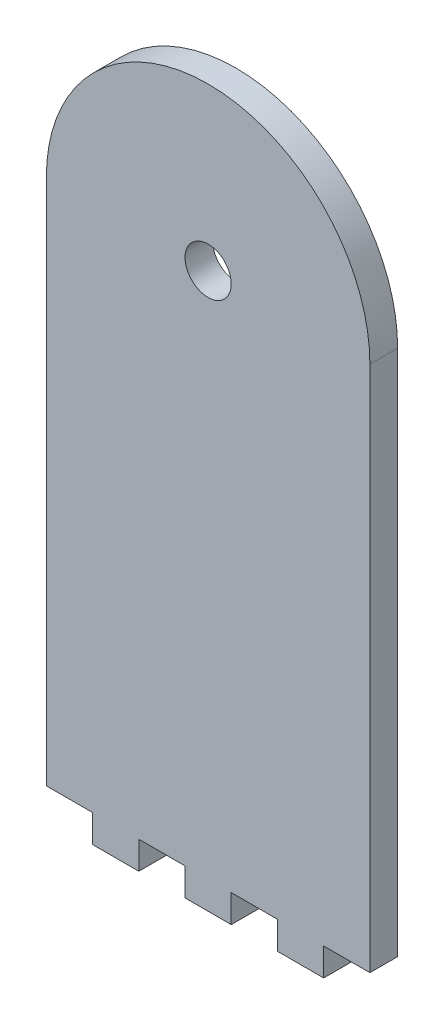
ISO-10303-21;
HEADER;
FILE_DESCRIPTION(('STEP AP214'),'2;1');
FILE_NAME('part.step','',(''),(''),'','','');
FILE_SCHEMA(('AUTOMOTIVE_DESIGN { 1 0 10303 214 1 1 1 1 }'));
ENDSEC;
DATA;
#1=APPLICATION_CONTEXT('core data for automotive mechanical design processes');
#2=APPLICATION_PROTOCOL_DEFINITION('international standard','automotive_design',2000,#1);
#3=PRODUCT_CONTEXT('',#1,'mechanical');
#4=PRODUCT('Part','Part','',(#3));
#5=PRODUCT_RELATED_PRODUCT_CATEGORY('part','',(#4));
#6=PRODUCT_DEFINITION_FORMATION('','',#4);
#7=PRODUCT_DEFINITION_CONTEXT('part definition',#1,'design');
#8=PRODUCT_DEFINITION('design','',#6,#7);
#9=PRODUCT_DEFINITION_SHAPE('','',#8);
#10=(LENGTH_UNIT() NAMED_UNIT(*) SI_UNIT(.MILLI.,.METRE.));
#11=(NAMED_UNIT(*) PLANE_ANGLE_UNIT() SI_UNIT($,.RADIAN.));
#12=(NAMED_UNIT(*) SI_UNIT($,.STERADIAN.) SOLID_ANGLE_UNIT());
#13=UNCERTAINTY_MEASURE_WITH_UNIT(LENGTH_MEASURE(1.E-05),#10,'distance_accuracy_value','');
#14=(GEOMETRIC_REPRESENTATION_CONTEXT(3) GLOBAL_UNCERTAINTY_ASSIGNED_CONTEXT((#13)) GLOBAL_UNIT_ASSIGNED_CONTEXT((#10,
#11,#12)) REPRESENTATION_CONTEXT('',''));
#15=CARTESIAN_POINT('',(0.,0.,0.));
#16=DIRECTION('',(0.,0.,1.));
#17=DIRECTION('',(1.,0.,0.));
#18=AXIS2_PLACEMENT_3D('',#15,#16,#17);
#19=CARTESIAN_POINT('',(0.,30.,3.));
#20=DIRECTION('',(0.,0.,-1.));
#21=DIRECTION('',(-1.,0.,0.));
#22=AXIS2_PLACEMENT_3D('',#19,#20,#21);
#23=PLANE('',#22);
#24=CARTESIAN_POINT('',(0.,30.,3.));
#25=DIRECTION('',(0.,0.,1.));
#26=DIRECTION('',(-1.,0.,0.));
#27=AXIS2_PLACEMENT_3D('',#24,#25,#26);
#28=CIRCLE('',#27,17.5);
#29=CARTESIAN_POINT('',(17.5,30.,3.));
#30=VERTEX_POINT('',#29);
#31=CARTESIAN_POINT('',(-17.5,30.,3.));
#32=VERTEX_POINT('',#31);
#33=EDGE_CURVE('E209',#30,#32,#28,.T.);
#34=ORIENTED_EDGE('',*,*,#33,.T.);
#35=DIRECTION('',(0.,-1.,0.));
#36=VECTOR('',#35,1.);
#37=CARTESIAN_POINT('',(-17.5,-27.,3.));
#38=LINE('',#37,#36);
#39=CARTESIAN_POINT('',(-17.5,-27.,3.));
#40=VERTEX_POINT('',#39);
#41=EDGE_CURVE('E117',#32,#40,#38,.T.);
#42=ORIENTED_EDGE('',*,*,#41,.T.);
#43=DIRECTION('',(1.,0.,0.));
#44=VECTOR('',#43,1.);
#45=CARTESIAN_POINT('',(-17.5,-27.,3.));
#46=LINE('',#45,#44);
#47=CARTESIAN_POINT('',(-12.5,-27.,3.));
#48=VERTEX_POINT('',#47);
#49=EDGE_CURVE('E248',#40,#48,#46,.T.);
#50=ORIENTED_EDGE('',*,*,#49,.T.);
#51=DIRECTION('',(0.,-1.,0.));
#52=VECTOR('',#51,1.);
#53=CARTESIAN_POINT('',(-12.5,-30.,3.));
#54=LINE('',#53,#52);
#55=CARTESIAN_POINT('',(-12.5,-30.,3.));
#56=VERTEX_POINT('',#55);
#57=EDGE_CURVE('E267',#48,#56,#54,.T.);
#58=ORIENTED_EDGE('',*,*,#57,.T.);
#59=DIRECTION('',(1.,0.,0.));
#60=VECTOR('',#59,1.);
#61=CARTESIAN_POINT('',(-12.5,-30.,3.));
#62=LINE('',#61,#60);
#63=CARTESIAN_POINT('',(-7.49999999999999,-30.,3.));
#64=VERTEX_POINT('',#63);
#65=EDGE_CURVE('E264',#56,#64,#62,.T.);
#66=ORIENTED_EDGE('',*,*,#65,.T.);
#67=DIRECTION('',(0.,1.,0.));
#68=VECTOR('',#67,1.);
#69=CARTESIAN_POINT('',(-7.49999999999999,-30.,3.));
#70=LINE('',#69,#68);
#71=CARTESIAN_POINT('',(-7.49999999999999,-27.,3.));
#72=VERTEX_POINT('',#71);
#73=EDGE_CURVE('E266',#64,#72,#70,.T.);
#74=ORIENTED_EDGE('',*,*,#73,.T.);
#75=DIRECTION('',(1.,0.,0.));
#76=VECTOR('',#75,1.);
#77=CARTESIAN_POINT('',(-7.49999999999999,-27.,3.));
#78=LINE('',#77,#76);
#79=CARTESIAN_POINT('',(-2.49999999999999,-27.,3.));
#80=VERTEX_POINT('',#79);
#81=EDGE_CURVE('E269',#72,#80,#78,.T.);
#82=ORIENTED_EDGE('',*,*,#81,.T.);
#83=DIRECTION('',(0.,-1.,0.));
#84=VECTOR('',#83,1.);
#85=CARTESIAN_POINT('',(-2.49999999999999,-27.,3.));
#86=LINE('',#85,#84);
#87=CARTESIAN_POINT('',(-2.49999999999999,-30.,3.));
#88=VERTEX_POINT('',#87);
#89=EDGE_CURVE('E275',#80,#88,#86,.T.);
#90=ORIENTED_EDGE('',*,*,#89,.T.);
#91=DIRECTION('',(1.,0.,0.));
#92=VECTOR('',#91,1.);
#93=CARTESIAN_POINT('',(-2.49999999999999,-30.,3.));
#94=LINE('',#93,#92);
#95=CARTESIAN_POINT('',(2.50000000000001,-30.,3.));
#96=VERTEX_POINT('',#95);
#97=EDGE_CURVE('E277',#88,#96,#94,.T.);
#98=ORIENTED_EDGE('',*,*,#97,.T.);
#99=DIRECTION('',(0.,1.,0.));
#100=VECTOR('',#99,1.);
#101=CARTESIAN_POINT('',(2.50000000000001,-30.,3.));
#102=LINE('',#101,#100);
#103=CARTESIAN_POINT('',(2.50000000000001,-27.,3.));
#104=VERTEX_POINT('',#103);
#105=EDGE_CURVE('E279',#96,#104,#102,.T.);
#106=ORIENTED_EDGE('',*,*,#105,.T.);
#107=DIRECTION('',(1.,0.,0.));
#108=VECTOR('',#107,1.);
#109=CARTESIAN_POINT('',(2.50000000000001,-27.,3.));
#110=LINE('',#109,#108);
#111=CARTESIAN_POINT('',(7.50000000000001,-27.,3.));
#112=VERTEX_POINT('',#111);
#113=EDGE_CURVE('E281',#104,#112,#110,.T.);
#114=ORIENTED_EDGE('',*,*,#113,.T.);
#115=DIRECTION('',(0.,-1.,0.));
#116=VECTOR('',#115,1.);
#117=CARTESIAN_POINT('',(7.50000000000001,-27.,3.));
#118=LINE('',#117,#116);
#119=CARTESIAN_POINT('',(7.50000000000001,-30.,3.));
#120=VERTEX_POINT('',#119);
#121=EDGE_CURVE('E283',#112,#120,#118,.T.);
#122=ORIENTED_EDGE('',*,*,#121,.T.);
#123=DIRECTION('',(1.,0.,0.));
#124=VECTOR('',#123,1.);
#125=CARTESIAN_POINT('',(7.50000000000001,-30.,3.));
#126=LINE('',#125,#124);
#127=CARTESIAN_POINT('',(12.5,-30.,3.));
#128=VERTEX_POINT('',#127);
#129=EDGE_CURVE('E160',#120,#128,#126,.T.);
#130=ORIENTED_EDGE('',*,*,#129,.T.);
#131=DIRECTION('',(0.,1.,0.));
#132=VECTOR('',#131,1.);
#133=CARTESIAN_POINT('',(12.5,-30.,3.));
#134=LINE('',#133,#132);
#135=CARTESIAN_POINT('',(12.5,-27.,3.));
#136=VERTEX_POINT('',#135);
#137=EDGE_CURVE('E154',#128,#136,#134,.T.);
#138=ORIENTED_EDGE('',*,*,#137,.T.);
#139=DIRECTION('',(1.,0.,0.));
#140=VECTOR('',#139,1.);
#141=CARTESIAN_POINT('',(12.5,-27.,3.));
#142=LINE('',#141,#140);
#143=CARTESIAN_POINT('',(17.5,-27.,3.));
#144=VERTEX_POINT('',#143);
#145=EDGE_CURVE('E158',#136,#144,#142,.T.);
#146=ORIENTED_EDGE('',*,*,#145,.T.);
#147=DIRECTION('',(0.,1.,0.));
#148=VECTOR('',#147,1.);
#149=CARTESIAN_POINT('',(17.5,-27.,3.));
#150=LINE('',#149,#148);
#151=EDGE_CURVE('E50',#144,#30,#150,.T.);
#152=ORIENTED_EDGE('',*,*,#151,.T.);
#153=EDGE_LOOP('',(#34,#42,#50,#58,#66,#74,#82,#90,#98,#106,#114,#122,#130,#138,#146,#152));
#154=FACE_BOUND('',#153,.T.);
#155=CARTESIAN_POINT('',(0.,30.,3.));
#156=DIRECTION('',(0.,0.,1.));
#157=DIRECTION('',(1.,0.,0.));
#158=AXIS2_PLACEMENT_3D('',#155,#156,#157);
#159=CIRCLE('',#158,2.5);
#160=CARTESIAN_POINT('',(2.5,30.,3.));
#161=VERTEX_POINT('',#160);
#162=EDGE_CURVE('E182',#161,#161,#159,.T.);
#163=ORIENTED_EDGE('',*,*,#162,.F.);
#164=EDGE_LOOP('',(#163));
#165=FACE_BOUND('',#164,.T.);
#166=ADVANCED_FACE('F33',(#154,#165),#23,.F.);
#167=CARTESIAN_POINT('',(0.,30.,0.));
#168=DIRECTION('',(0.,0.,-1.));
#169=DIRECTION('',(-1.,0.,0.));
#170=AXIS2_PLACEMENT_3D('',#167,#168,#169);
#171=PLANE('',#170);
#172=CARTESIAN_POINT('',(0.,30.,0.));
#173=DIRECTION('',(0.,0.,1.));
#174=DIRECTION('',(-1.,0.,0.));
#175=AXIS2_PLACEMENT_3D('',#172,#173,#174);
#176=CIRCLE('',#175,17.5);
#177=CARTESIAN_POINT('',(17.5,30.,0.));
#178=VERTEX_POINT('',#177);
#179=CARTESIAN_POINT('',(-17.5,30.,0.));
#180=VERTEX_POINT('',#179);
#181=EDGE_CURVE('E178',#178,#180,#176,.T.);
#182=ORIENTED_EDGE('',*,*,#181,.F.);
#183=DIRECTION('',(0.,1.,0.));
#184=VECTOR('',#183,1.);
#185=CARTESIAN_POINT('',(17.5,-27.,0.));
#186=LINE('',#185,#184);
#187=CARTESIAN_POINT('',(17.5,-27.,0.));
#188=VERTEX_POINT('',#187);
#189=EDGE_CURVE('E109',#188,#178,#186,.T.);
#190=ORIENTED_EDGE('',*,*,#189,.F.);
#191=DIRECTION('',(1.,0.,0.));
#192=VECTOR('',#191,1.);
#193=CARTESIAN_POINT('',(12.5,-27.,0.));
#194=LINE('',#193,#192);
#195=CARTESIAN_POINT('',(12.5,-27.,0.));
#196=VERTEX_POINT('',#195);
#197=EDGE_CURVE('E103',#196,#188,#194,.T.);
#198=ORIENTED_EDGE('',*,*,#197,.F.);
#199=DIRECTION('',(0.,1.,0.));
#200=VECTOR('',#199,1.);
#201=CARTESIAN_POINT('',(12.5,-30.,0.));
#202=LINE('',#201,#200);
#203=CARTESIAN_POINT('',(12.5,-30.,0.));
#204=VERTEX_POINT('',#203);
#205=EDGE_CURVE('E168',#204,#196,#202,.T.);
#206=ORIENTED_EDGE('',*,*,#205,.F.);
#207=DIRECTION('',(1.,0.,0.));
#208=VECTOR('',#207,1.);
#209=CARTESIAN_POINT('',(7.50000000000001,-30.,0.));
#210=LINE('',#209,#208);
#211=CARTESIAN_POINT('',(7.50000000000001,-30.,0.));
#212=VERTEX_POINT('',#211);
#213=EDGE_CURVE('E204',#212,#204,#210,.T.);
#214=ORIENTED_EDGE('',*,*,#213,.F.);
#215=DIRECTION('',(0.,-1.,0.));
#216=VECTOR('',#215,1.);
#217=CARTESIAN_POINT('',(7.50000000000001,-27.,0.));
#218=LINE('',#217,#216);
#219=CARTESIAN_POINT('',(7.50000000000001,-27.,0.));
#220=VERTEX_POINT('',#219);
#221=EDGE_CURVE('E202',#220,#212,#218,.T.);
#222=ORIENTED_EDGE('',*,*,#221,.F.);
#223=DIRECTION('',(1.,0.,0.));
#224=VECTOR('',#223,1.);
#225=CARTESIAN_POINT('',(2.50000000000001,-27.,0.));
#226=LINE('',#225,#224);
#227=CARTESIAN_POINT('',(2.50000000000001,-27.,0.));
#228=VERTEX_POINT('',#227);
#229=EDGE_CURVE('E200',#228,#220,#226,.T.);
#230=ORIENTED_EDGE('',*,*,#229,.F.);
#231=DIRECTION('',(0.,1.,0.));
#232=VECTOR('',#231,1.);
#233=CARTESIAN_POINT('',(2.50000000000001,-30.,0.));
#234=LINE('',#233,#232);
#235=CARTESIAN_POINT('',(2.50000000000001,-30.,0.));
#236=VERTEX_POINT('',#235);
#237=EDGE_CURVE('E198',#236,#228,#234,.T.);
#238=ORIENTED_EDGE('',*,*,#237,.F.);
#239=DIRECTION('',(1.,0.,0.));
#240=VECTOR('',#239,1.);
#241=CARTESIAN_POINT('',(-2.49999999999999,-30.,0.));
#242=LINE('',#241,#240);
#243=CARTESIAN_POINT('',(-2.49999999999999,-30.,0.));
#244=VERTEX_POINT('',#243);
#245=EDGE_CURVE('E196',#244,#236,#242,.T.);
#246=ORIENTED_EDGE('',*,*,#245,.F.);
#247=DIRECTION('',(0.,-1.,0.));
#248=VECTOR('',#247,1.);
#249=CARTESIAN_POINT('',(-2.49999999999999,-27.,0.));
#250=LINE('',#249,#248);
#251=CARTESIAN_POINT('',(-2.49999999999999,-27.,0.));
#252=VERTEX_POINT('',#251);
#253=EDGE_CURVE('E194',#252,#244,#250,.T.);
#254=ORIENTED_EDGE('',*,*,#253,.F.);
#255=DIRECTION('',(1.,0.,0.));
#256=VECTOR('',#255,1.);
#257=CARTESIAN_POINT('',(-7.49999999999999,-27.,0.));
#258=LINE('',#257,#256);
#259=CARTESIAN_POINT('',(-7.49999999999999,-27.,0.));
#260=VERTEX_POINT('',#259);
#261=EDGE_CURVE('E192',#260,#252,#258,.T.);
#262=ORIENTED_EDGE('',*,*,#261,.F.);
#263=DIRECTION('',(0.,1.,0.));
#264=VECTOR('',#263,1.);
#265=CARTESIAN_POINT('',(-7.49999999999999,-30.,0.));
#266=LINE('',#265,#264);
#267=CARTESIAN_POINT('',(-7.49999999999999,-30.,0.));
#268=VERTEX_POINT('',#267);
#269=EDGE_CURVE('E190',#268,#260,#266,.T.);
#270=ORIENTED_EDGE('',*,*,#269,.F.);
#271=DIRECTION('',(1.,0.,0.));
#272=VECTOR('',#271,1.);
#273=CARTESIAN_POINT('',(-12.5,-30.,0.));
#274=LINE('',#273,#272);
#275=CARTESIAN_POINT('',(-12.5,-30.,0.));
#276=VERTEX_POINT('',#275);
#277=EDGE_CURVE('E188',#276,#268,#274,.T.);
#278=ORIENTED_EDGE('',*,*,#277,.F.);
#279=DIRECTION('',(0.,-1.,0.));
#280=VECTOR('',#279,1.);
#281=CARTESIAN_POINT('',(-12.5,-30.,0.));
#282=LINE('',#281,#280);
#283=CARTESIAN_POINT('',(-12.5,-27.,0.));
#284=VERTEX_POINT('',#283);
#285=EDGE_CURVE('E186',#284,#276,#282,.T.);
#286=ORIENTED_EDGE('',*,*,#285,.F.);
#287=DIRECTION('',(1.,0.,0.));
#288=VECTOR('',#287,1.);
#289=CARTESIAN_POINT('',(-17.5,-27.,0.));
#290=LINE('',#289,#288);
#291=CARTESIAN_POINT('',(-17.5,-27.,0.));
#292=VERTEX_POINT('',#291);
#293=EDGE_CURVE('E184',#292,#284,#290,.T.);
#294=ORIENTED_EDGE('',*,*,#293,.F.);
#295=DIRECTION('',(0.,-1.,0.));
#296=VECTOR('',#295,1.);
#297=CARTESIAN_POINT('',(-17.5,-27.,0.));
#298=LINE('',#297,#296);
#299=EDGE_CURVE('E181',#180,#292,#298,.T.);
#300=ORIENTED_EDGE('',*,*,#299,.F.);
#301=EDGE_LOOP('',(#182,#190,#198,#206,#214,#222,#230,#238,#246,#254,#262,#270,#278,#286,#294,#300));
#302=FACE_BOUND('',#301,.T.);
#303=CARTESIAN_POINT('',(0.,30.,0.));
#304=DIRECTION('',(0.,0.,1.));
#305=DIRECTION('',(1.,0.,0.));
#306=AXIS2_PLACEMENT_3D('',#303,#304,#305);
#307=CIRCLE('',#306,2.5);
#308=CARTESIAN_POINT('',(2.5,30.,0.));
#309=VERTEX_POINT('',#308);
#310=EDGE_CURVE('E482',#309,#309,#307,.T.);
#311=ORIENTED_EDGE('',*,*,#310,.T.);
#312=EDGE_LOOP('',(#311));
#313=FACE_BOUND('',#312,.T.);
#314=ADVANCED_FACE('F252',(#302,#313),#171,.T.);
#315=CARTESIAN_POINT('',(0.,30.,3.));
#316=DIRECTION('',(0.,0.,-1.));
#317=DIRECTION('',(-1.,0.,0.));
#318=AXIS2_PLACEMENT_3D('',#315,#316,#317);
#319=CYLINDRICAL_SURFACE('',#318,17.5);
#320=ORIENTED_EDGE('',*,*,#181,.T.);
#321=DIRECTION('',(0.,0.,-1.));
#322=VECTOR('',#321,1.);
#323=CARTESIAN_POINT('',(-17.5,30.,3.));
#324=LINE('',#323,#322);
#325=EDGE_CURVE('E11',#32,#180,#324,.T.);
#326=ORIENTED_EDGE('',*,*,#325,.F.);
#327=ORIENTED_EDGE('',*,*,#33,.F.);
#328=DIRECTION('',(0.,0.,-1.));
#329=VECTOR('',#328,1.);
#330=CARTESIAN_POINT('',(17.5,30.,3.));
#331=LINE('',#330,#329);
#332=EDGE_CURVE('E174',#30,#178,#331,.T.);
#333=ORIENTED_EDGE('',*,*,#332,.T.);
#334=EDGE_LOOP('',(#320,#326,#327,#333));
#335=FACE_BOUND('',#334,.T.);
#336=ADVANCED_FACE('F35',(#335),#319,.T.);
#337=CARTESIAN_POINT('',(-17.5,-27.,3.));
#338=DIRECTION('',(1.,0.,0.));
#339=DIRECTION('',(0.,0.,-1.));
#340=AXIS2_PLACEMENT_3D('',#337,#338,#339);
#341=PLANE('',#340);
#342=ORIENTED_EDGE('',*,*,#299,.T.);
#343=DIRECTION('',(0.,0.,-1.));
#344=VECTOR('',#343,1.);
#345=CARTESIAN_POINT('',(-17.5,-27.,3.));
#346=LINE('',#345,#344);
#347=EDGE_CURVE('E42',#40,#292,#346,.T.);
#348=ORIENTED_EDGE('',*,*,#347,.F.);
#349=ORIENTED_EDGE('',*,*,#41,.F.);
#350=ORIENTED_EDGE('',*,*,#325,.T.);
#351=EDGE_LOOP('',(#342,#348,#349,#350));
#352=FACE_BOUND('',#351,.T.);
#353=ADVANCED_FACE('F317',(#352),#341,.F.);
#354=CARTESIAN_POINT('',(-17.5,-27.,3.));
#355=DIRECTION('',(0.,1.,0.));
#356=DIRECTION('',(0.,0.,1.));
#357=AXIS2_PLACEMENT_3D('',#354,#355,#356);
#358=PLANE('',#357);
#359=ORIENTED_EDGE('',*,*,#293,.T.);
#360=DIRECTION('',(0.,0.,-1.));
#361=VECTOR('',#360,1.);
#362=CARTESIAN_POINT('',(-12.5,-27.,3.));
#363=LINE('',#362,#361);
#364=EDGE_CURVE('E240',#48,#284,#363,.T.);
#365=ORIENTED_EDGE('',*,*,#364,.F.);
#366=ORIENTED_EDGE('',*,*,#49,.F.);
#367=ORIENTED_EDGE('',*,*,#347,.T.);
#368=EDGE_LOOP('',(#359,#365,#366,#367));
#369=FACE_BOUND('',#368,.T.);
#370=ADVANCED_FACE('F246',(#369),#358,.F.);
#371=CARTESIAN_POINT('',(-12.5,-30.,3.));
#372=DIRECTION('',(1.,0.,0.));
#373=DIRECTION('',(0.,0.,-1.));
#374=AXIS2_PLACEMENT_3D('',#371,#372,#373);
#375=PLANE('',#374);
#376=ORIENTED_EDGE('',*,*,#285,.T.);
#377=DIRECTION('',(0.,0.,-1.));
#378=VECTOR('',#377,1.);
#379=CARTESIAN_POINT('',(-12.5,-30.,3.));
#380=LINE('',#379,#378);
#381=EDGE_CURVE('E237',#56,#276,#380,.T.);
#382=ORIENTED_EDGE('',*,*,#381,.F.);
#383=ORIENTED_EDGE('',*,*,#57,.F.);
#384=ORIENTED_EDGE('',*,*,#364,.T.);
#385=EDGE_LOOP('',(#376,#382,#383,#384));
#386=FACE_BOUND('',#385,.T.);
#387=ADVANCED_FACE('F258',(#386),#375,.F.);
#388=CARTESIAN_POINT('',(-12.5,-30.,3.));
#389=DIRECTION('',(0.,1.,0.));
#390=DIRECTION('',(0.,0.,1.));
#391=AXIS2_PLACEMENT_3D('',#388,#389,#390);
#392=PLANE('',#391);
#393=ORIENTED_EDGE('',*,*,#277,.T.);
#394=DIRECTION('',(0.,0.,-1.));
#395=VECTOR('',#394,1.);
#396=CARTESIAN_POINT('',(-7.49999999999999,-30.,3.));
#397=LINE('',#396,#395);
#398=EDGE_CURVE('E234',#64,#268,#397,.T.);
#399=ORIENTED_EDGE('',*,*,#398,.F.);
#400=ORIENTED_EDGE('',*,*,#65,.F.);
#401=ORIENTED_EDGE('',*,*,#381,.T.);
#402=EDGE_LOOP('',(#393,#399,#400,#401));
#403=FACE_BOUND('',#402,.T.);
#404=ADVANCED_FACE('F262',(#403),#392,.F.);
#405=CARTESIAN_POINT('',(-7.49999999999999,-30.,3.));
#406=DIRECTION('',(-1.,0.,0.));
#407=DIRECTION('',(0.,0.,1.));
#408=AXIS2_PLACEMENT_3D('',#405,#406,#407);
#409=PLANE('',#408);
#410=ORIENTED_EDGE('',*,*,#269,.T.);
#411=DIRECTION('',(0.,0.,-1.));
#412=VECTOR('',#411,1.);
#413=CARTESIAN_POINT('',(-7.49999999999999,-27.,3.));
#414=LINE('',#413,#412);
#415=EDGE_CURVE('E231',#72,#260,#414,.T.);
#416=ORIENTED_EDGE('',*,*,#415,.F.);
#417=ORIENTED_EDGE('',*,*,#73,.F.);
#418=ORIENTED_EDGE('',*,*,#398,.T.);
#419=EDGE_LOOP('',(#410,#416,#417,#418));
#420=FACE_BOUND('',#419,.T.);
#421=ADVANCED_FACE('F330',(#420),#409,.F.);
#422=CARTESIAN_POINT('',(-7.49999999999999,-27.,3.));
#423=DIRECTION('',(0.,1.,0.));
#424=DIRECTION('',(0.,0.,1.));
#425=AXIS2_PLACEMENT_3D('',#422,#423,#424);
#426=PLANE('',#425);
#427=ORIENTED_EDGE('',*,*,#261,.T.);
#428=DIRECTION('',(0.,0.,-1.));
#429=VECTOR('',#428,1.);
#430=CARTESIAN_POINT('',(-2.49999999999999,-27.,3.));
#431=LINE('',#430,#429);
#432=EDGE_CURVE('E228',#80,#252,#431,.T.);
#433=ORIENTED_EDGE('',*,*,#432,.F.);
#434=ORIENTED_EDGE('',*,*,#81,.F.);
#435=ORIENTED_EDGE('',*,*,#415,.T.);
#436=EDGE_LOOP('',(#427,#433,#434,#435));
#437=FACE_BOUND('',#436,.T.);
#438=ADVANCED_FACE('F333',(#437),#426,.F.);
#439=CARTESIAN_POINT('',(-2.49999999999999,-27.,3.));
#440=DIRECTION('',(1.,0.,0.));
#441=DIRECTION('',(0.,1.,0.));
#442=AXIS2_PLACEMENT_3D('',#439,#440,#441);
#443=PLANE('',#442);
#444=ORIENTED_EDGE('',*,*,#253,.T.);
#445=DIRECTION('',(0.,0.,-1.));
#446=VECTOR('',#445,1.);
#447=CARTESIAN_POINT('',(-2.49999999999999,-30.,3.));
#448=LINE('',#447,#446);
#449=EDGE_CURVE('E225',#88,#244,#448,.T.);
#450=ORIENTED_EDGE('',*,*,#449,.F.);
#451=ORIENTED_EDGE('',*,*,#89,.F.);
#452=ORIENTED_EDGE('',*,*,#432,.T.);
#453=EDGE_LOOP('',(#444,#450,#451,#452));
#454=FACE_BOUND('',#453,.T.);
#455=ADVANCED_FACE('F337',(#454),#443,.F.);
#456=CARTESIAN_POINT('',(-2.49999999999999,-30.,3.));
#457=DIRECTION('',(0.,1.,0.));
#458=DIRECTION('',(0.,0.,1.));
#459=AXIS2_PLACEMENT_3D('',#456,#457,#458);
#460=PLANE('',#459);
#461=ORIENTED_EDGE('',*,*,#245,.T.);
#462=DIRECTION('',(0.,0.,-1.));
#463=VECTOR('',#462,1.);
#464=CARTESIAN_POINT('',(2.50000000000001,-30.,3.));
#465=LINE('',#464,#463);
#466=EDGE_CURVE('E222',#96,#236,#465,.T.);
#467=ORIENTED_EDGE('',*,*,#466,.F.);
#468=ORIENTED_EDGE('',*,*,#97,.F.);
#469=ORIENTED_EDGE('',*,*,#449,.T.);
#470=EDGE_LOOP('',(#461,#467,#468,#469));
#471=FACE_BOUND('',#470,.T.);
#472=ADVANCED_FACE('F341',(#471),#460,.F.);
#473=CARTESIAN_POINT('',(2.50000000000001,-30.,3.));
#474=DIRECTION('',(-1.,0.,0.));
#475=DIRECTION('',(0.,0.,1.));
#476=AXIS2_PLACEMENT_3D('',#473,#474,#475);
#477=PLANE('',#476);
#478=ORIENTED_EDGE('',*,*,#237,.T.);
#479=DIRECTION('',(0.,0.,-1.));
#480=VECTOR('',#479,1.);
#481=CARTESIAN_POINT('',(2.50000000000001,-27.,3.));
#482=LINE('',#481,#480);
#483=EDGE_CURVE('E219',#104,#228,#482,.T.);
#484=ORIENTED_EDGE('',*,*,#483,.F.);
#485=ORIENTED_EDGE('',*,*,#105,.F.);
#486=ORIENTED_EDGE('',*,*,#466,.T.);
#487=EDGE_LOOP('',(#478,#484,#485,#486));
#488=FACE_BOUND('',#487,.T.);
#489=ADVANCED_FACE('F345',(#488),#477,.F.);
#490=CARTESIAN_POINT('',(2.50000000000001,-27.,3.));
#491=DIRECTION('',(0.,1.,0.));
#492=DIRECTION('',(-1.,0.,0.));
#493=AXIS2_PLACEMENT_3D('',#490,#491,#492);
#494=PLANE('',#493);
#495=ORIENTED_EDGE('',*,*,#229,.T.);
#496=DIRECTION('',(0.,0.,-1.));
#497=VECTOR('',#496,1.);
#498=CARTESIAN_POINT('',(7.50000000000001,-27.,3.));
#499=LINE('',#498,#497);
#500=EDGE_CURVE('E216',#112,#220,#499,.T.);
#501=ORIENTED_EDGE('',*,*,#500,.F.);
#502=ORIENTED_EDGE('',*,*,#113,.F.);
#503=ORIENTED_EDGE('',*,*,#483,.T.);
#504=EDGE_LOOP('',(#495,#501,#502,#503));
#505=FACE_BOUND('',#504,.T.);
#506=ADVANCED_FACE('F349',(#505),#494,.F.);
#507=CARTESIAN_POINT('',(7.50000000000001,-27.,3.));
#508=DIRECTION('',(1.,0.,0.));
#509=DIRECTION('',(0.,1.,0.));
#510=AXIS2_PLACEMENT_3D('',#507,#508,#509);
#511=PLANE('',#510);
#512=ORIENTED_EDGE('',*,*,#221,.T.);
#513=DIRECTION('',(0.,0.,-1.));
#514=VECTOR('',#513,1.);
#515=CARTESIAN_POINT('',(7.50000000000001,-30.,3.));
#516=LINE('',#515,#514);
#517=EDGE_CURVE('E213',#120,#212,#516,.T.);
#518=ORIENTED_EDGE('',*,*,#517,.F.);
#519=ORIENTED_EDGE('',*,*,#121,.F.);
#520=ORIENTED_EDGE('',*,*,#500,.T.);
#521=EDGE_LOOP('',(#512,#518,#519,#520));
#522=FACE_BOUND('',#521,.T.);
#523=ADVANCED_FACE('F289',(#522),#511,.F.);
#524=CARTESIAN_POINT('',(7.50000000000001,-30.,3.));
#525=DIRECTION('',(0.,1.,0.));
#526=DIRECTION('',(0.,0.,1.));
#527=AXIS2_PLACEMENT_3D('',#524,#525,#526);
#528=PLANE('',#527);
#529=ORIENTED_EDGE('',*,*,#213,.T.);
#530=DIRECTION('',(0.,0.,-1.));
#531=VECTOR('',#530,1.);
#532=CARTESIAN_POINT('',(12.5,-30.,3.));
#533=LINE('',#532,#531);
#534=EDGE_CURVE('E169',#128,#204,#533,.T.);
#535=ORIENTED_EDGE('',*,*,#534,.F.);
#536=ORIENTED_EDGE('',*,*,#129,.F.);
#537=ORIENTED_EDGE('',*,*,#517,.T.);
#538=EDGE_LOOP('',(#529,#535,#536,#537));
#539=FACE_BOUND('',#538,.T.);
#540=ADVANCED_FACE('F293',(#539),#528,.F.);
#541=CARTESIAN_POINT('',(12.5,-30.,3.));
#542=DIRECTION('',(-1.,0.,0.));
#543=DIRECTION('',(0.,0.,1.));
#544=AXIS2_PLACEMENT_3D('',#541,#542,#543);
#545=PLANE('',#544);
#546=ORIENTED_EDGE('',*,*,#205,.T.);
#547=DIRECTION('',(0.,0.,-1.));
#548=VECTOR('',#547,1.);
#549=CARTESIAN_POINT('',(12.5,-27.,3.));
#550=LINE('',#549,#548);
#551=EDGE_CURVE('E165',#136,#196,#550,.T.);
#552=ORIENTED_EDGE('',*,*,#551,.F.);
#553=ORIENTED_EDGE('',*,*,#137,.F.);
#554=ORIENTED_EDGE('',*,*,#534,.T.);
#555=EDGE_LOOP('',(#546,#552,#553,#554));
#556=FACE_BOUND('',#555,.T.);
#557=ADVANCED_FACE('F166',(#556),#545,.F.);
#558=CARTESIAN_POINT('',(12.5,-27.,3.));
#559=DIRECTION('',(0.,1.,0.));
#560=DIRECTION('',(0.,0.,1.));
#561=AXIS2_PLACEMENT_3D('',#558,#559,#560);
#562=PLANE('',#561);
#563=ORIENTED_EDGE('',*,*,#197,.T.);
#564=DIRECTION('',(0.,0.,-1.));
#565=VECTOR('',#564,1.);
#566=CARTESIAN_POINT('',(17.5,-27.,3.));
#567=LINE('',#566,#565);
#568=EDGE_CURVE('E170',#144,#188,#567,.T.);
#569=ORIENTED_EDGE('',*,*,#568,.F.);
#570=ORIENTED_EDGE('',*,*,#145,.F.);
#571=ORIENTED_EDGE('',*,*,#551,.T.);
#572=EDGE_LOOP('',(#563,#569,#570,#571));
#573=FACE_BOUND('',#572,.T.);
#574=ADVANCED_FACE('F172',(#573),#562,.F.);
#575=CARTESIAN_POINT('',(17.5,-27.,3.));
#576=DIRECTION('',(-1.,0.,0.));
#577=DIRECTION('',(0.,0.,1.));
#578=AXIS2_PLACEMENT_3D('',#575,#576,#577);
#579=PLANE('',#578);
#580=ORIENTED_EDGE('',*,*,#189,.T.);
#581=ORIENTED_EDGE('',*,*,#332,.F.);
#582=ORIENTED_EDGE('',*,*,#151,.F.);
#583=ORIENTED_EDGE('',*,*,#568,.T.);
#584=EDGE_LOOP('',(#580,#581,#582,#583));
#585=FACE_BOUND('',#584,.T.);
#586=ADVANCED_FACE('F297',(#585),#579,.F.);
#587=CARTESIAN_POINT('',(0.,30.,3.));
#588=DIRECTION('',(0.,0.,-1.));
#589=DIRECTION('',(-1.,0.,0.));
#590=AXIS2_PLACEMENT_3D('',#587,#588,#589);
#591=CYLINDRICAL_SURFACE('',#590,2.5);
#592=ORIENTED_EDGE('',*,*,#162,.T.);
#593=EDGE_LOOP('',(#592));
#594=FACE_BOUND('',#593,.T.);
#595=ORIENTED_EDGE('',*,*,#310,.F.);
#596=EDGE_LOOP('',(#595));
#597=FACE_BOUND('',#596,.T.);
#598=ADVANCED_FACE('F299',(#594,#597),#591,.F.);
#599=CLOSED_SHELL('',(#166,#314,#336,#353,#370,#387,#404,#421,#438,#455,#472,#489,#506,#523,
#540,#557,#574,#586,#598));
#600=MANIFOLD_SOLID_BREP('B2',#599);
#601=ADVANCED_BREP_SHAPE_REPRESENTATION('',(#18,#600),#14);
#602=SHAPE_DEFINITION_REPRESENTATION(#9,#601);
ENDSEC;
END-ISO-10303-21;
